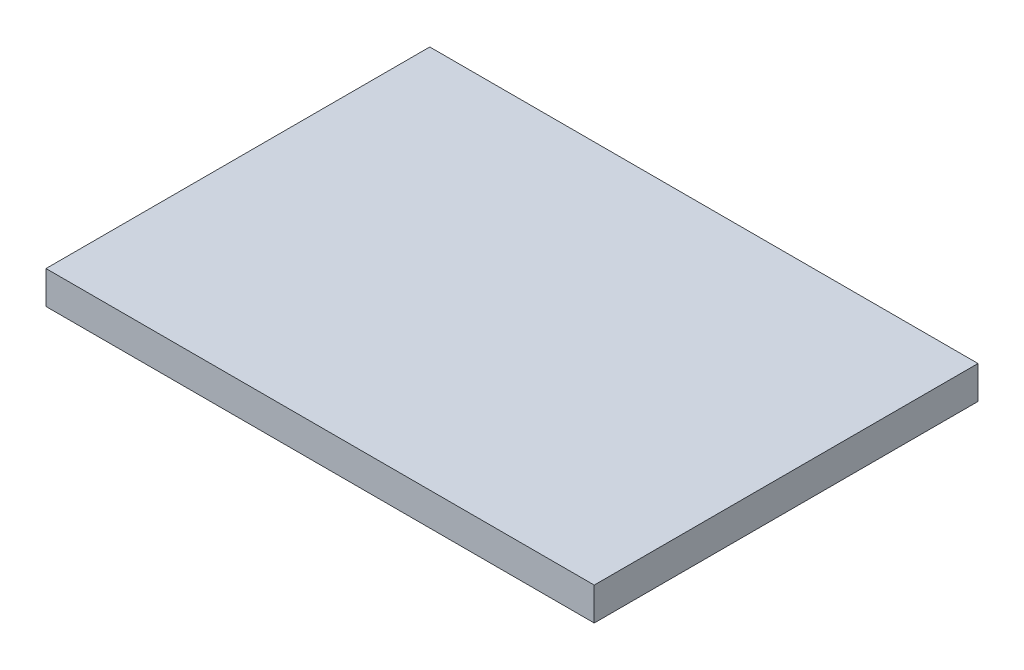
ISO-10303-21;
HEADER;
FILE_DESCRIPTION(('STEP AP214'),'2;1');
FILE_NAME('part.step','',(''),(''),'','','');
FILE_SCHEMA(('AUTOMOTIVE_DESIGN { 1 0 10303 214 1 1 1 1 }'));
ENDSEC;
DATA;
#1=APPLICATION_CONTEXT('core data for automotive mechanical design processes');
#2=APPLICATION_PROTOCOL_DEFINITION('international standard','automotive_design',2000,#1);
#3=PRODUCT_CONTEXT('',#1,'mechanical');
#4=PRODUCT('Part','Part','',(#3));
#5=PRODUCT_RELATED_PRODUCT_CATEGORY('part','',(#4));
#6=PRODUCT_DEFINITION_FORMATION('','',#4);
#7=PRODUCT_DEFINITION_CONTEXT('part definition',#1,'design');
#8=PRODUCT_DEFINITION('design','',#6,#7);
#9=PRODUCT_DEFINITION_SHAPE('','',#8);
#10=(LENGTH_UNIT() NAMED_UNIT(*) SI_UNIT(.MILLI.,.METRE.));
#11=(NAMED_UNIT(*) PLANE_ANGLE_UNIT() SI_UNIT($,.RADIAN.));
#12=(NAMED_UNIT(*) SI_UNIT($,.STERADIAN.) SOLID_ANGLE_UNIT());
#13=UNCERTAINTY_MEASURE_WITH_UNIT(LENGTH_MEASURE(1.E-05),#10,'distance_accuracy_value','');
#14=(GEOMETRIC_REPRESENTATION_CONTEXT(3) GLOBAL_UNCERTAINTY_ASSIGNED_CONTEXT((#13)) GLOBAL_UNIT_ASSIGNED_CONTEXT((#10,
#11,#12)) REPRESENTATION_CONTEXT('',''));
#15=CARTESIAN_POINT('',(0.,0.,0.));
#16=DIRECTION('',(0.,0.,1.));
#17=DIRECTION('',(1.,0.,0.));
#18=AXIS2_PLACEMENT_3D('',#15,#16,#17);
#19=CARTESIAN_POINT('',(25.,1.5,17.5));
#20=DIRECTION('',(-1.,0.,0.));
#21=DIRECTION('',(0.,0.,1.));
#22=AXIS2_PLACEMENT_3D('',#19,#20,#21);
#23=PLANE('',#22);
#24=DIRECTION('',(0.,0.,-1.));
#25=VECTOR('',#24,1.);
#26=CARTESIAN_POINT('',(25.,-1.5,17.5));
#27=LINE('',#26,#25);
#28=CARTESIAN_POINT('',(25.,-1.5,17.5));
#29=VERTEX_POINT('',#28);
#30=CARTESIAN_POINT('',(25.,-1.5,-17.5));
#31=VERTEX_POINT('',#30);
#32=EDGE_CURVE('E97',#29,#31,#27,.T.);
#33=ORIENTED_EDGE('',*,*,#32,.T.);
#34=DIRECTION('',(0.,-1.,0.));
#35=VECTOR('',#34,1.);
#36=CARTESIAN_POINT('',(25.,1.5,-17.5));
#37=LINE('',#36,#35);
#38=CARTESIAN_POINT('',(25.,1.5,-17.5));
#39=VERTEX_POINT('',#38);
#40=EDGE_CURVE('E11',#39,#31,#37,.T.);
#41=ORIENTED_EDGE('',*,*,#40,.F.);
#42=DIRECTION('',(0.,0.,-1.));
#43=VECTOR('',#42,1.);
#44=CARTESIAN_POINT('',(25.,1.5,17.5));
#45=LINE('',#44,#43);
#46=CARTESIAN_POINT('',(25.,1.5,17.5));
#47=VERTEX_POINT('',#46);
#48=EDGE_CURVE('E85',#47,#39,#45,.T.);
#49=ORIENTED_EDGE('',*,*,#48,.F.);
#50=DIRECTION('',(0.,-1.,0.));
#51=VECTOR('',#50,1.);
#52=CARTESIAN_POINT('',(25.,1.5,17.5));
#53=LINE('',#52,#51);
#54=EDGE_CURVE('E93',#47,#29,#53,.T.);
#55=ORIENTED_EDGE('',*,*,#54,.T.);
#56=EDGE_LOOP('',(#33,#41,#49,#55));
#57=FACE_BOUND('',#56,.T.);
#58=ADVANCED_FACE('F34',(#57),#23,.F.);
#59=CARTESIAN_POINT('',(-25.,1.5,-17.5));
#60=DIRECTION('',(0.,0.,1.));
#61=DIRECTION('',(1.,0.,0.));
#62=AXIS2_PLACEMENT_3D('',#59,#60,#61);
#63=PLANE('',#62);
#64=DIRECTION('',(-1.,0.,0.));
#65=VECTOR('',#64,1.);
#66=CARTESIAN_POINT('',(-25.,-1.5,-17.5));
#67=LINE('',#66,#65);
#68=CARTESIAN_POINT('',(-25.,-1.5,-17.5));
#69=VERTEX_POINT('',#68);
#70=EDGE_CURVE('E89',#31,#69,#67,.T.);
#71=ORIENTED_EDGE('',*,*,#70,.T.);
#72=DIRECTION('',(0.,-1.,0.));
#73=VECTOR('',#72,1.);
#74=CARTESIAN_POINT('',(-25.,1.5,-17.5));
#75=LINE('',#74,#73);
#76=CARTESIAN_POINT('',(-25.,1.5,-17.5));
#77=VERTEX_POINT('',#76);
#78=EDGE_CURVE('E42',#77,#69,#75,.T.);
#79=ORIENTED_EDGE('',*,*,#78,.F.);
#80=DIRECTION('',(-1.,0.,0.));
#81=VECTOR('',#80,1.);
#82=CARTESIAN_POINT('',(-25.,1.5,-17.5));
#83=LINE('',#82,#81);
#84=EDGE_CURVE('E80',#39,#77,#83,.T.);
#85=ORIENTED_EDGE('',*,*,#84,.F.);
#86=ORIENTED_EDGE('',*,*,#40,.T.);
#87=EDGE_LOOP('',(#71,#79,#85,#86));
#88=FACE_BOUND('',#87,.T.);
#89=ADVANCED_FACE('F88',(#88),#63,.F.);
#90=CARTESIAN_POINT('',(-25.,1.5,17.5));
#91=DIRECTION('',(1.,0.,0.));
#92=DIRECTION('',(0.,0.,-1.));
#93=AXIS2_PLACEMENT_3D('',#90,#91,#92);
#94=PLANE('',#93);
#95=DIRECTION('',(0.,0.,1.));
#96=VECTOR('',#95,1.);
#97=CARTESIAN_POINT('',(-25.,-1.5,17.5));
#98=LINE('',#97,#96);
#99=CARTESIAN_POINT('',(-25.,-1.5,17.5));
#100=VERTEX_POINT('',#99);
#101=EDGE_CURVE('E67',#69,#100,#98,.T.);
#102=ORIENTED_EDGE('',*,*,#101,.T.);
#103=DIRECTION('',(0.,-1.,0.));
#104=VECTOR('',#103,1.);
#105=CARTESIAN_POINT('',(-25.,1.5,17.5));
#106=LINE('',#105,#104);
#107=CARTESIAN_POINT('',(-25.,1.5,17.5));
#108=VERTEX_POINT('',#107);
#109=EDGE_CURVE('E90',#108,#100,#106,.T.);
#110=ORIENTED_EDGE('',*,*,#109,.F.);
#111=DIRECTION('',(0.,0.,1.));
#112=VECTOR('',#111,1.);
#113=CARTESIAN_POINT('',(-25.,1.5,17.5));
#114=LINE('',#113,#112);
#115=EDGE_CURVE('E83',#77,#108,#114,.T.);
#116=ORIENTED_EDGE('',*,*,#115,.F.);
#117=ORIENTED_EDGE('',*,*,#78,.T.);
#118=EDGE_LOOP('',(#102,#110,#116,#117));
#119=FACE_BOUND('',#118,.T.);
#120=ADVANCED_FACE('F91',(#119),#94,.F.);
#121=CARTESIAN_POINT('',(-25.,1.5,17.5));
#122=DIRECTION('',(0.,0.,-1.));
#123=DIRECTION('',(-1.,0.,0.));
#124=AXIS2_PLACEMENT_3D('',#121,#122,#123);
#125=PLANE('',#124);
#126=DIRECTION('',(1.,0.,0.));
#127=VECTOR('',#126,1.);
#128=CARTESIAN_POINT('',(-25.,-1.5,17.5));
#129=LINE('',#128,#127);
#130=EDGE_CURVE('E73',#100,#29,#129,.T.);
#131=ORIENTED_EDGE('',*,*,#130,.T.);
#132=ORIENTED_EDGE('',*,*,#54,.F.);
#133=DIRECTION('',(1.,0.,0.));
#134=VECTOR('',#133,1.);
#135=CARTESIAN_POINT('',(-25.,1.5,17.5));
#136=LINE('',#135,#134);
#137=EDGE_CURVE('E50',#108,#47,#136,.T.);
#138=ORIENTED_EDGE('',*,*,#137,.F.);
#139=ORIENTED_EDGE('',*,*,#109,.T.);
#140=EDGE_LOOP('',(#131,#132,#138,#139));
#141=FACE_BOUND('',#140,.T.);
#142=ADVANCED_FACE('F104',(#141),#125,.F.);
#143=CARTESIAN_POINT('',(0.,1.5,0.));
#144=DIRECTION('',(0.,-1.,0.));
#145=DIRECTION('',(0.,0.,-1.));
#146=AXIS2_PLACEMENT_3D('',#143,#144,#145);
#147=PLANE('',#146);
#148=ORIENTED_EDGE('',*,*,#48,.T.);
#149=ORIENTED_EDGE('',*,*,#84,.T.);
#150=ORIENTED_EDGE('',*,*,#115,.T.);
#151=ORIENTED_EDGE('',*,*,#137,.T.);
#152=EDGE_LOOP('',(#148,#149,#150,#151));
#153=FACE_BOUND('',#152,.T.);
#154=ADVANCED_FACE('F81',(#153),#147,.F.);
#155=CARTESIAN_POINT('',(0.,-1.5,0.));
#156=DIRECTION('',(0.,-1.,0.));
#157=DIRECTION('',(0.,0.,-1.));
#158=AXIS2_PLACEMENT_3D('',#155,#156,#157);
#159=PLANE('',#158);
#160=ORIENTED_EDGE('',*,*,#32,.F.);
#161=ORIENTED_EDGE('',*,*,#130,.F.);
#162=ORIENTED_EDGE('',*,*,#101,.F.);
#163=ORIENTED_EDGE('',*,*,#70,.F.);
#164=EDGE_LOOP('',(#160,#161,#162,#163));
#165=FACE_BOUND('',#164,.T.);
#166=ADVANCED_FACE('F107',(#165),#159,.T.);
#167=CLOSED_SHELL('',(#58,#89,#120,#142,#154,#166));
#168=MANIFOLD_SOLID_BREP('B2',#167);
#169=ADVANCED_BREP_SHAPE_REPRESENTATION('',(#18,#168),#14);
#170=SHAPE_DEFINITION_REPRESENTATION(#9,#169);
ENDSEC;
END-ISO-10303-21;
